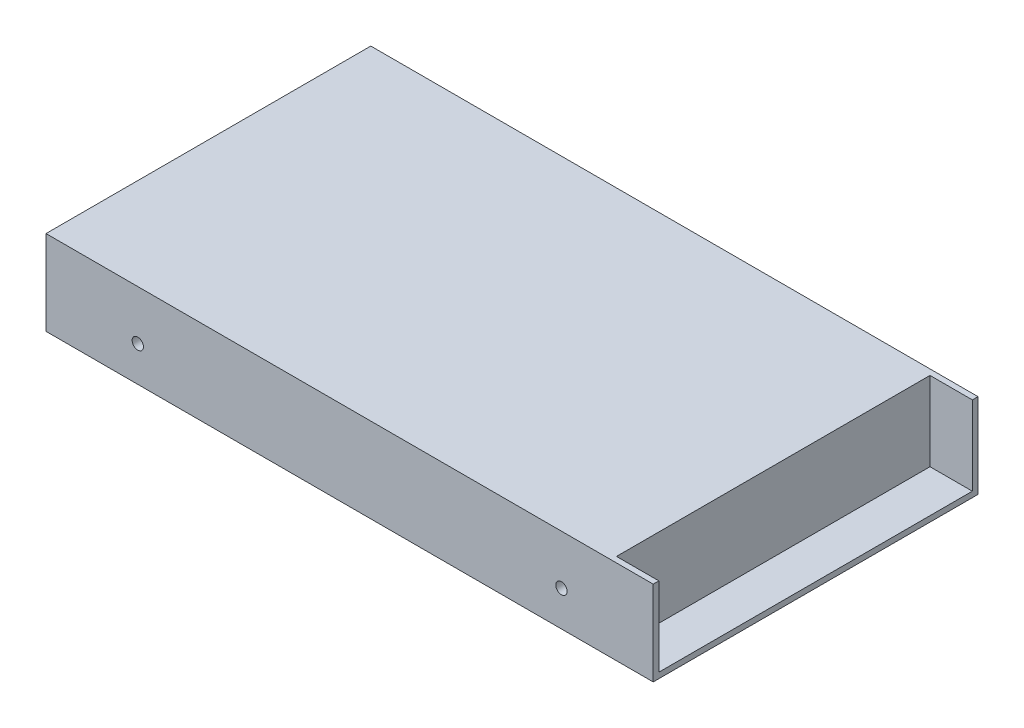
ISO-10303-21;
HEADER;
FILE_DESCRIPTION(('STEP AP214'),'2;1');
FILE_NAME('part.step','',(''),(''),'','','');
FILE_SCHEMA(('AUTOMOTIVE_DESIGN { 1 0 10303 214 1 1 1 1 }'));
ENDSEC;
DATA;
#1=APPLICATION_CONTEXT('core data for automotive mechanical design processes');
#2=APPLICATION_PROTOCOL_DEFINITION('international standard','automotive_design',2000,#1);
#3=PRODUCT_CONTEXT('',#1,'mechanical');
#4=PRODUCT('Part','Part','',(#3));
#5=PRODUCT_RELATED_PRODUCT_CATEGORY('part','',(#4));
#6=PRODUCT_DEFINITION_FORMATION('','',#4);
#7=PRODUCT_DEFINITION_CONTEXT('part definition',#1,'design');
#8=PRODUCT_DEFINITION('design','',#6,#7);
#9=PRODUCT_DEFINITION_SHAPE('','',#8);
#10=(LENGTH_UNIT() NAMED_UNIT(*) SI_UNIT(.MILLI.,.METRE.));
#11=(NAMED_UNIT(*) PLANE_ANGLE_UNIT() SI_UNIT($,.RADIAN.));
#12=(NAMED_UNIT(*) SI_UNIT($,.STERADIAN.) SOLID_ANGLE_UNIT());
#13=UNCERTAINTY_MEASURE_WITH_UNIT(LENGTH_MEASURE(1.E-05),#10,'distance_accuracy_value','');
#14=(GEOMETRIC_REPRESENTATION_CONTEXT(3) GLOBAL_UNCERTAINTY_ASSIGNED_CONTEXT((#13)) GLOBAL_UNIT_ASSIGNED_CONTEXT((#10,
#11,#12)) REPRESENTATION_CONTEXT('',''));
#15=CARTESIAN_POINT('',(0.,0.,0.));
#16=DIRECTION('',(0.,0.,1.));
#17=DIRECTION('',(1.,0.,0.));
#18=AXIS2_PLACEMENT_3D('',#15,#16,#17);
#19=CARTESIAN_POINT('',(107.5,30.,57.5));
#20=DIRECTION('',(-1.,0.,0.));
#21=DIRECTION('',(0.,0.,1.));
#22=AXIS2_PLACEMENT_3D('',#19,#20,#21);
#23=PLANE('',#22);
#24=DIRECTION('',(0.,0.,-1.));
#25=VECTOR('',#24,1.);
#26=CARTESIAN_POINT('',(107.5,30.,57.5));
#27=LINE('',#26,#25);
#28=CARTESIAN_POINT('',(107.5,30.,-55.5));
#29=VERTEX_POINT('',#28);
#30=CARTESIAN_POINT('',(107.5,30.,-57.5));
#31=VERTEX_POINT('',#30);
#32=EDGE_CURVE('E87',#29,#31,#27,.T.);
#33=ORIENTED_EDGE('',*,*,#32,.F.);
#34=DIRECTION('',(0.,1.,0.));
#35=VECTOR('',#34,1.);
#36=CARTESIAN_POINT('',(107.5,-112.008928215567,-55.5));
#37=LINE('',#36,#35);
#38=CARTESIAN_POINT('',(107.5,2.,-55.5));
#39=VERTEX_POINT('',#38);
#40=EDGE_CURVE('E136',#39,#29,#37,.T.);
#41=ORIENTED_EDGE('',*,*,#40,.F.);
#42=DIRECTION('',(0.,0.,-1.));
#43=VECTOR('',#42,1.);
#44=CARTESIAN_POINT('',(107.5,2.,-55.5));
#45=LINE('',#44,#43);
#46=CARTESIAN_POINT('',(107.5,2.,55.5));
#47=VERTEX_POINT('',#46);
#48=EDGE_CURVE('E127',#47,#39,#45,.T.);
#49=ORIENTED_EDGE('',*,*,#48,.F.);
#50=DIRECTION('',(0.,1.,0.));
#51=VECTOR('',#50,1.);
#52=CARTESIAN_POINT('',(107.5,-112.008928215567,55.5));
#53=LINE('',#52,#51);
#54=CARTESIAN_POINT('',(107.5,30.,55.5));
#55=VERTEX_POINT('',#54);
#56=EDGE_CURVE('E137',#47,#55,#53,.T.);
#57=ORIENTED_EDGE('',*,*,#56,.T.);
#58=CARTESIAN_POINT('',(107.5,30.,57.5));
#59=VERTEX_POINT('',#58);
#60=EDGE_CURVE('E145',#59,#55,#27,.T.);
#61=ORIENTED_EDGE('',*,*,#60,.F.);
#62=DIRECTION('',(0.,-1.,0.));
#63=VECTOR('',#62,1.);
#64=CARTESIAN_POINT('',(107.5,30.,57.5));
#65=LINE('',#64,#63);
#66=CARTESIAN_POINT('',(107.5,0.,57.5));
#67=VERTEX_POINT('',#66);
#68=EDGE_CURVE('E152',#59,#67,#65,.T.);
#69=ORIENTED_EDGE('',*,*,#68,.T.);
#70=DIRECTION('',(0.,0.,-1.));
#71=VECTOR('',#70,1.);
#72=CARTESIAN_POINT('',(107.5,0.,57.5));
#73=LINE('',#72,#71);
#74=CARTESIAN_POINT('',(107.5,0.,-57.5));
#75=VERTEX_POINT('',#74);
#76=EDGE_CURVE('E144',#67,#75,#73,.T.);
#77=ORIENTED_EDGE('',*,*,#76,.T.);
#78=DIRECTION('',(0.,-1.,0.));
#79=VECTOR('',#78,1.);
#80=CARTESIAN_POINT('',(107.5,30.,-57.5));
#81=LINE('',#80,#79);
#82=EDGE_CURVE('E12',#31,#75,#81,.T.);
#83=ORIENTED_EDGE('',*,*,#82,.F.);
#84=EDGE_LOOP('',(#33,#41,#49,#57,#61,#69,#77,#83));
#85=FACE_BOUND('',#84,.T.);
#86=ADVANCED_FACE('F36',(#85),#23,.F.);
#87=CARTESIAN_POINT('',(-107.5,30.,-57.5));
#88=DIRECTION('',(0.,0.,1.));
#89=DIRECTION('',(1.,0.,0.));
#90=AXIS2_PLACEMENT_3D('',#87,#88,#89);
#91=PLANE('',#90);
#92=CARTESIAN_POINT('',(75.,12.5,-57.5));
#93=DIRECTION('',(0.,0.,-1.));
#94=DIRECTION('',(-1.,0.,0.));
#95=AXIS2_PLACEMENT_3D('',#92,#93,#94);
#96=CIRCLE('',#95,2.);
#97=CARTESIAN_POINT('',(73.,12.5,-57.5));
#98=VERTEX_POINT('',#97);
#99=EDGE_CURVE('E205',#98,#98,#96,.T.);
#100=ORIENTED_EDGE('',*,*,#99,.F.);
#101=EDGE_LOOP('',(#100));
#102=FACE_BOUND('',#101,.T.);
#103=CARTESIAN_POINT('',(-75.,12.5,-57.5));
#104=DIRECTION('',(0.,0.,-1.));
#105=DIRECTION('',(-1.,0.,0.));
#106=AXIS2_PLACEMENT_3D('',#103,#104,#105);
#107=CIRCLE('',#106,2.);
#108=CARTESIAN_POINT('',(-77.,12.5,-57.5));
#109=VERTEX_POINT('',#108);
#110=EDGE_CURVE('E208',#109,#109,#107,.T.);
#111=ORIENTED_EDGE('',*,*,#110,.F.);
#112=EDGE_LOOP('',(#111));
#113=FACE_BOUND('',#112,.T.);
#114=DIRECTION('',(-1.,0.,0.));
#115=VECTOR('',#114,1.);
#116=CARTESIAN_POINT('',(-107.5,0.,-57.5));
#117=LINE('',#116,#115);
#118=CARTESIAN_POINT('',(-107.5,0.,-57.5));
#119=VERTEX_POINT('',#118);
#120=EDGE_CURVE('E155',#75,#119,#117,.T.);
#121=ORIENTED_EDGE('',*,*,#120,.T.);
#122=DIRECTION('',(0.,-1.,0.));
#123=VECTOR('',#122,1.);
#124=CARTESIAN_POINT('',(-107.5,30.,-57.5));
#125=LINE('',#124,#123);
#126=CARTESIAN_POINT('',(-107.5,30.,-57.5));
#127=VERTEX_POINT('',#126);
#128=EDGE_CURVE('E43',#127,#119,#125,.T.);
#129=ORIENTED_EDGE('',*,*,#128,.F.);
#130=DIRECTION('',(-1.,0.,0.));
#131=VECTOR('',#130,1.);
#132=CARTESIAN_POINT('',(-107.5,30.,-57.5));
#133=LINE('',#132,#131);
#134=EDGE_CURVE('E147',#31,#127,#133,.T.);
#135=ORIENTED_EDGE('',*,*,#134,.F.);
#136=ORIENTED_EDGE('',*,*,#82,.T.);
#137=EDGE_LOOP('',(#121,#129,#135,#136));
#138=FACE_BOUND('',#137,.T.);
#139=ADVANCED_FACE('F188',(#102,#113,#138),#91,.F.);
#140=CARTESIAN_POINT('',(-107.5,30.,57.5));
#141=DIRECTION('',(1.,0.,0.));
#142=DIRECTION('',(0.,0.,-1.));
#143=AXIS2_PLACEMENT_3D('',#140,#141,#142);
#144=PLANE('',#143);
#145=DIRECTION('',(0.,0.,1.));
#146=VECTOR('',#145,1.);
#147=CARTESIAN_POINT('',(-107.5,0.,57.5));
#148=LINE('',#147,#146);
#149=CARTESIAN_POINT('',(-107.5,0.,57.5));
#150=VERTEX_POINT('',#149);
#151=EDGE_CURVE('E157',#119,#150,#148,.T.);
#152=ORIENTED_EDGE('',*,*,#151,.T.);
#153=DIRECTION('',(0.,-1.,0.));
#154=VECTOR('',#153,1.);
#155=CARTESIAN_POINT('',(-107.5,30.,57.5));
#156=LINE('',#155,#154);
#157=CARTESIAN_POINT('',(-107.5,30.,57.5));
#158=VERTEX_POINT('',#157);
#159=EDGE_CURVE('E161',#158,#150,#156,.T.);
#160=ORIENTED_EDGE('',*,*,#159,.F.);
#161=DIRECTION('',(0.,0.,1.));
#162=VECTOR('',#161,1.);
#163=CARTESIAN_POINT('',(-107.5,30.,57.5));
#164=LINE('',#163,#162);
#165=EDGE_CURVE('E149',#127,#158,#164,.T.);
#166=ORIENTED_EDGE('',*,*,#165,.F.);
#167=ORIENTED_EDGE('',*,*,#128,.T.);
#168=EDGE_LOOP('',(#152,#160,#166,#167));
#169=FACE_BOUND('',#168,.T.);
#170=ADVANCED_FACE('F167',(#169),#144,.F.);
#171=CARTESIAN_POINT('',(-107.5,30.,57.5));
#172=DIRECTION('',(0.,0.,-1.));
#173=DIRECTION('',(-1.,0.,0.));
#174=AXIS2_PLACEMENT_3D('',#171,#172,#173);
#175=PLANE('',#174);
#176=CARTESIAN_POINT('',(75.,12.5,57.5));
#177=DIRECTION('',(0.,0.,1.));
#178=DIRECTION('',(1.,0.,0.));
#179=AXIS2_PLACEMENT_3D('',#176,#177,#178);
#180=CIRCLE('',#179,2.);
#181=CARTESIAN_POINT('',(77.,12.5,57.5));
#182=VERTEX_POINT('',#181);
#183=EDGE_CURVE('E219',#182,#182,#180,.T.);
#184=ORIENTED_EDGE('',*,*,#183,.F.);
#185=EDGE_LOOP('',(#184));
#186=FACE_BOUND('',#185,.T.);
#187=CARTESIAN_POINT('',(-75.,12.5,57.5));
#188=DIRECTION('',(0.,0.,1.));
#189=DIRECTION('',(1.,0.,0.));
#190=AXIS2_PLACEMENT_3D('',#187,#188,#189);
#191=CIRCLE('',#190,2.);
#192=CARTESIAN_POINT('',(-73.,12.5,57.5));
#193=VERTEX_POINT('',#192);
#194=EDGE_CURVE('E212',#193,#193,#191,.T.);
#195=ORIENTED_EDGE('',*,*,#194,.F.);
#196=EDGE_LOOP('',(#195));
#197=FACE_BOUND('',#196,.T.);
#198=DIRECTION('',(1.,0.,0.));
#199=VECTOR('',#198,1.);
#200=CARTESIAN_POINT('',(-107.5,0.,57.5));
#201=LINE('',#200,#199);
#202=EDGE_CURVE('E80',#150,#67,#201,.T.);
#203=ORIENTED_EDGE('',*,*,#202,.T.);
#204=ORIENTED_EDGE('',*,*,#68,.F.);
#205=DIRECTION('',(1.,0.,0.));
#206=VECTOR('',#205,1.);
#207=CARTESIAN_POINT('',(-107.5,30.,57.5));
#208=LINE('',#207,#206);
#209=EDGE_CURVE('E59',#158,#59,#208,.T.);
#210=ORIENTED_EDGE('',*,*,#209,.F.);
#211=ORIENTED_EDGE('',*,*,#159,.T.);
#212=EDGE_LOOP('',(#203,#204,#210,#211));
#213=FACE_BOUND('',#212,.T.);
#214=ADVANCED_FACE('F176',(#186,#197,#213),#175,.F.);
#215=CARTESIAN_POINT('',(0.,30.,0.));
#216=DIRECTION('',(0.,-1.,0.));
#217=DIRECTION('',(0.,0.,-1.));
#218=AXIS2_PLACEMENT_3D('',#215,#216,#217);
#219=PLANE('',#218);
#220=DIRECTION('',(0.,0.,1.));
#221=VECTOR('',#220,1.);
#222=CARTESIAN_POINT('',(92.5,30.,-55.5));
#223=LINE('',#222,#221);
#224=CARTESIAN_POINT('',(92.5,30.,-55.5));
#225=VERTEX_POINT('',#224);
#226=CARTESIAN_POINT('',(92.5,30.,55.5));
#227=VERTEX_POINT('',#226);
#228=EDGE_CURVE('E50',#225,#227,#223,.T.);
#229=ORIENTED_EDGE('',*,*,#228,.F.);
#230=DIRECTION('',(-1.,0.,0.));
#231=VECTOR('',#230,1.);
#232=CARTESIAN_POINT('',(107.5,30.,-55.5));
#233=LINE('',#232,#231);
#234=EDGE_CURVE('E123',#29,#225,#233,.T.);
#235=ORIENTED_EDGE('',*,*,#234,.F.);
#236=ORIENTED_EDGE('',*,*,#32,.T.);
#237=ORIENTED_EDGE('',*,*,#134,.T.);
#238=ORIENTED_EDGE('',*,*,#165,.T.);
#239=ORIENTED_EDGE('',*,*,#209,.T.);
#240=ORIENTED_EDGE('',*,*,#60,.T.);
#241=DIRECTION('',(1.,0.,0.));
#242=VECTOR('',#241,1.);
#243=CARTESIAN_POINT('',(107.5,30.,55.5));
#244=LINE('',#243,#242);
#245=EDGE_CURVE('E129',#227,#55,#244,.T.);
#246=ORIENTED_EDGE('',*,*,#245,.F.);
#247=EDGE_LOOP('',(#229,#235,#236,#237,#238,#239,#240,#246));
#248=FACE_BOUND('',#247,.T.);
#249=ADVANCED_FACE('F178',(#248),#219,.F.);
#250=CARTESIAN_POINT('',(0.,0.,0.));
#251=DIRECTION('',(0.,-1.,0.));
#252=DIRECTION('',(0.,0.,-1.));
#253=AXIS2_PLACEMENT_3D('',#250,#251,#252);
#254=PLANE('',#253);
#255=CARTESIAN_POINT('',(75.,0.,25.));
#256=DIRECTION('',(0.,-1.,0.));
#257=DIRECTION('',(0.,0.,-1.));
#258=AXIS2_PLACEMENT_3D('',#255,#256,#257);
#259=CIRCLE('',#258,2.);
#260=CARTESIAN_POINT('',(75.,0.,23.));
#261=VERTEX_POINT('',#260);
#262=EDGE_CURVE('E230',#261,#261,#259,.T.);
#263=ORIENTED_EDGE('',*,*,#262,.F.);
#264=EDGE_LOOP('',(#263));
#265=FACE_BOUND('',#264,.T.);
#266=CARTESIAN_POINT('',(-75.,0.,25.));
#267=DIRECTION('',(0.,-1.,0.));
#268=DIRECTION('',(0.,0.,-1.));
#269=AXIS2_PLACEMENT_3D('',#266,#267,#268);
#270=CIRCLE('',#269,2.);
#271=CARTESIAN_POINT('',(-75.,0.,23.));
#272=VERTEX_POINT('',#271);
#273=EDGE_CURVE('E237',#272,#272,#270,.T.);
#274=ORIENTED_EDGE('',*,*,#273,.F.);
#275=EDGE_LOOP('',(#274));
#276=FACE_BOUND('',#275,.T.);
#277=CARTESIAN_POINT('',(-75.,0.,-25.));
#278=DIRECTION('',(0.,-1.,0.));
#279=DIRECTION('',(0.,0.,-1.));
#280=AXIS2_PLACEMENT_3D('',#277,#278,#279);
#281=CIRCLE('',#280,2.);
#282=CARTESIAN_POINT('',(-75.,0.,-27.));
#283=VERTEX_POINT('',#282);
#284=EDGE_CURVE('E243',#283,#283,#281,.T.);
#285=ORIENTED_EDGE('',*,*,#284,.F.);
#286=EDGE_LOOP('',(#285));
#287=FACE_BOUND('',#286,.T.);
#288=CARTESIAN_POINT('',(75.,0.,-25.));
#289=DIRECTION('',(0.,-1.,0.));
#290=DIRECTION('',(0.,0.,-1.));
#291=AXIS2_PLACEMENT_3D('',#288,#289,#290);
#292=CIRCLE('',#291,2.);
#293=CARTESIAN_POINT('',(75.,0.,-27.));
#294=VERTEX_POINT('',#293);
#295=EDGE_CURVE('E224',#294,#294,#292,.T.);
#296=ORIENTED_EDGE('',*,*,#295,.F.);
#297=EDGE_LOOP('',(#296));
#298=FACE_BOUND('',#297,.T.);
#299=ORIENTED_EDGE('',*,*,#76,.F.);
#300=ORIENTED_EDGE('',*,*,#202,.F.);
#301=ORIENTED_EDGE('',*,*,#151,.F.);
#302=ORIENTED_EDGE('',*,*,#120,.F.);
#303=EDGE_LOOP('',(#299,#300,#301,#302));
#304=FACE_BOUND('',#303,.T.);
#305=ADVANCED_FACE('F172',(#265,#276,#287,#298,#304),#254,.T.);
#306=CARTESIAN_POINT('',(0.,2.,0.));
#307=DIRECTION('',(0.,-1.,0.));
#308=DIRECTION('',(0.,0.,-1.));
#309=AXIS2_PLACEMENT_3D('',#306,#307,#308);
#310=PLANE('',#309);
#311=ORIENTED_EDGE('',*,*,#48,.T.);
#312=DIRECTION('',(-1.,0.,0.));
#313=VECTOR('',#312,1.);
#314=CARTESIAN_POINT('',(107.5,2.,-55.5));
#315=LINE('',#314,#313);
#316=CARTESIAN_POINT('',(92.5,2.,-55.5));
#317=VERTEX_POINT('',#316);
#318=EDGE_CURVE('E121',#39,#317,#315,.T.);
#319=ORIENTED_EDGE('',*,*,#318,.T.);
#320=DIRECTION('',(0.,0.,1.));
#321=VECTOR('',#320,1.);
#322=CARTESIAN_POINT('',(92.5,2.,-55.5));
#323=LINE('',#322,#321);
#324=CARTESIAN_POINT('',(92.5,2.,55.5));
#325=VERTEX_POINT('',#324);
#326=EDGE_CURVE('E109',#317,#325,#323,.T.);
#327=ORIENTED_EDGE('',*,*,#326,.T.);
#328=DIRECTION('',(1.,0.,0.));
#329=VECTOR('',#328,1.);
#330=CARTESIAN_POINT('',(107.5,2.,55.5));
#331=LINE('',#330,#329);
#332=EDGE_CURVE('E138',#325,#47,#331,.T.);
#333=ORIENTED_EDGE('',*,*,#332,.T.);
#334=EDGE_LOOP('',(#311,#319,#327,#333));
#335=FACE_BOUND('',#334,.T.);
#336=ADVANCED_FACE('F125',(#335),#310,.F.);
#337=CARTESIAN_POINT('',(107.5,-112.008928215567,-55.5));
#338=DIRECTION('',(0.,0.,-1.));
#339=DIRECTION('',(-1.,0.,0.));
#340=AXIS2_PLACEMENT_3D('',#337,#338,#339);
#341=PLANE('',#340);
#342=ORIENTED_EDGE('',*,*,#40,.T.);
#343=ORIENTED_EDGE('',*,*,#234,.T.);
#344=DIRECTION('',(0.,1.,0.));
#345=VECTOR('',#344,1.);
#346=CARTESIAN_POINT('',(92.5,-112.008928215567,-55.5));
#347=LINE('',#346,#345);
#348=EDGE_CURVE('E112',#317,#225,#347,.T.);
#349=ORIENTED_EDGE('',*,*,#348,.F.);
#350=ORIENTED_EDGE('',*,*,#318,.F.);
#351=EDGE_LOOP('',(#342,#343,#349,#350));
#352=FACE_BOUND('',#351,.T.);
#353=ADVANCED_FACE('F120',(#352),#341,.F.);
#354=CARTESIAN_POINT('',(92.5,-112.008928215567,-55.5));
#355=DIRECTION('',(-1.,0.,0.));
#356=DIRECTION('',(0.,0.,1.));
#357=AXIS2_PLACEMENT_3D('',#354,#355,#356);
#358=PLANE('',#357);
#359=ORIENTED_EDGE('',*,*,#348,.T.);
#360=ORIENTED_EDGE('',*,*,#228,.T.);
#361=DIRECTION('',(0.,1.,0.));
#362=VECTOR('',#361,1.);
#363=CARTESIAN_POINT('',(92.5,-112.008928215567,55.5));
#364=LINE('',#363,#362);
#365=EDGE_CURVE('E114',#325,#227,#364,.T.);
#366=ORIENTED_EDGE('',*,*,#365,.F.);
#367=ORIENTED_EDGE('',*,*,#326,.F.);
#368=EDGE_LOOP('',(#359,#360,#366,#367));
#369=FACE_BOUND('',#368,.T.);
#370=ADVANCED_FACE('F111',(#369),#358,.F.);
#371=CARTESIAN_POINT('',(107.5,-112.008928215567,55.5));
#372=DIRECTION('',(0.,0.,1.));
#373=DIRECTION('',(1.,0.,0.));
#374=AXIS2_PLACEMENT_3D('',#371,#372,#373);
#375=PLANE('',#374);
#376=ORIENTED_EDGE('',*,*,#365,.T.);
#377=ORIENTED_EDGE('',*,*,#245,.T.);
#378=ORIENTED_EDGE('',*,*,#56,.F.);
#379=ORIENTED_EDGE('',*,*,#332,.F.);
#380=EDGE_LOOP('',(#376,#377,#378,#379));
#381=FACE_BOUND('',#380,.T.);
#382=ADVANCED_FACE('F322',(#381),#375,.F.);
#383=CARTESIAN_POINT('',(-75.,12.5,52.5));
#384=DIRECTION('',(0.,0.,1.));
#385=DIRECTION('',(1.,0.,0.));
#386=AXIS2_PLACEMENT_3D('',#383,#384,#385);
#387=CYLINDRICAL_SURFACE('',#386,2.);
#388=CARTESIAN_POINT('',(-75.,12.5,52.5));
#389=DIRECTION('',(0.,0.,1.));
#390=DIRECTION('',(1.,0.,0.));
#391=AXIS2_PLACEMENT_3D('',#388,#389,#390);
#392=CIRCLE('',#391,2.);
#393=CARTESIAN_POINT('',(-73.,12.5,52.5));
#394=VERTEX_POINT('',#393);
#395=EDGE_CURVE('E215',#394,#394,#392,.T.);
#396=ORIENTED_EDGE('',*,*,#395,.F.);
#397=EDGE_LOOP('',(#396));
#398=FACE_BOUND('',#397,.T.);
#399=ORIENTED_EDGE('',*,*,#194,.T.);
#400=EDGE_LOOP('',(#399));
#401=FACE_BOUND('',#400,.T.);
#402=ADVANCED_FACE('F318',(#398,#401),#387,.F.);
#403=CARTESIAN_POINT('',(-75.,12.5,52.5));
#404=DIRECTION('',(0.,0.,1.));
#405=DIRECTION('',(1.,0.,0.));
#406=AXIS2_PLACEMENT_3D('',#403,#404,#405);
#407=PLANE('',#406);
#408=ORIENTED_EDGE('',*,*,#395,.T.);
#409=EDGE_LOOP('',(#408));
#410=FACE_BOUND('',#409,.T.);
#411=ADVANCED_FACE('F314',(#410),#407,.T.);
#412=CARTESIAN_POINT('',(75.,12.5,52.5));
#413=DIRECTION('',(0.,0.,1.));
#414=DIRECTION('',(1.,0.,0.));
#415=AXIS2_PLACEMENT_3D('',#412,#413,#414);
#416=CYLINDRICAL_SURFACE('',#415,2.);
#417=CARTESIAN_POINT('',(75.,12.5,52.5));
#418=DIRECTION('',(0.,0.,1.));
#419=DIRECTION('',(1.,0.,0.));
#420=AXIS2_PLACEMENT_3D('',#417,#418,#419);
#421=CIRCLE('',#420,2.);
#422=CARTESIAN_POINT('',(77.,12.5,52.5));
#423=VERTEX_POINT('',#422);
#424=EDGE_CURVE('E210',#423,#423,#421,.T.);
#425=ORIENTED_EDGE('',*,*,#424,.F.);
#426=EDGE_LOOP('',(#425));
#427=FACE_BOUND('',#426,.T.);
#428=ORIENTED_EDGE('',*,*,#183,.T.);
#429=EDGE_LOOP('',(#428));
#430=FACE_BOUND('',#429,.T.);
#431=ADVANCED_FACE('F310',(#427,#430),#416,.F.);
#432=CARTESIAN_POINT('',(75.,12.5,52.5));
#433=DIRECTION('',(0.,0.,1.));
#434=DIRECTION('',(1.,0.,0.));
#435=AXIS2_PLACEMENT_3D('',#432,#433,#434);
#436=PLANE('',#435);
#437=ORIENTED_EDGE('',*,*,#424,.T.);
#438=EDGE_LOOP('',(#437));
#439=FACE_BOUND('',#438,.T.);
#440=ADVANCED_FACE('F306',(#439),#436,.T.);
#441=CARTESIAN_POINT('',(75.,3.,-25.));
#442=DIRECTION('',(0.,-1.,0.));
#443=DIRECTION('',(0.,0.,-1.));
#444=AXIS2_PLACEMENT_3D('',#441,#442,#443);
#445=CYLINDRICAL_SURFACE('',#444,2.);
#446=CARTESIAN_POINT('',(75.,3.,-25.));
#447=DIRECTION('',(0.,-1.,0.));
#448=DIRECTION('',(0.,0.,-1.));
#449=AXIS2_PLACEMENT_3D('',#446,#447,#448);
#450=CIRCLE('',#449,2.);
#451=CARTESIAN_POINT('',(75.,3.,-27.));
#452=VERTEX_POINT('',#451);
#453=EDGE_CURVE('E216',#452,#452,#450,.T.);
#454=ORIENTED_EDGE('',*,*,#453,.F.);
#455=EDGE_LOOP('',(#454));
#456=FACE_BOUND('',#455,.T.);
#457=ORIENTED_EDGE('',*,*,#295,.T.);
#458=EDGE_LOOP('',(#457));
#459=FACE_BOUND('',#458,.T.);
#460=ADVANCED_FACE('F302',(#456,#459),#445,.F.);
#461=CARTESIAN_POINT('',(75.,3.,-25.));
#462=DIRECTION('',(0.,-1.,0.));
#463=DIRECTION('',(0.,0.,-1.));
#464=AXIS2_PLACEMENT_3D('',#461,#462,#463);
#465=PLANE('',#464);
#466=ORIENTED_EDGE('',*,*,#453,.T.);
#467=EDGE_LOOP('',(#466));
#468=FACE_BOUND('',#467,.T.);
#469=ADVANCED_FACE('F284',(#468),#465,.T.);
#470=CARTESIAN_POINT('',(-75.,3.,-25.));
#471=DIRECTION('',(0.,-1.,0.));
#472=DIRECTION('',(0.,0.,-1.));
#473=AXIS2_PLACEMENT_3D('',#470,#471,#472);
#474=CYLINDRICAL_SURFACE('',#473,2.);
#475=CARTESIAN_POINT('',(-75.,3.,-25.));
#476=DIRECTION('',(0.,-1.,0.));
#477=DIRECTION('',(0.,0.,-1.));
#478=AXIS2_PLACEMENT_3D('',#475,#476,#477);
#479=CIRCLE('',#478,2.);
#480=CARTESIAN_POINT('',(-75.,3.,-27.));
#481=VERTEX_POINT('',#480);
#482=EDGE_CURVE('E227',#481,#481,#479,.T.);
#483=ORIENTED_EDGE('',*,*,#482,.F.);
#484=EDGE_LOOP('',(#483));
#485=FACE_BOUND('',#484,.T.);
#486=ORIENTED_EDGE('',*,*,#284,.T.);
#487=EDGE_LOOP('',(#486));
#488=FACE_BOUND('',#487,.T.);
#489=ADVANCED_FACE('F280',(#485,#488),#474,.F.);
#490=CARTESIAN_POINT('',(-75.,3.,-25.));
#491=DIRECTION('',(0.,-1.,0.));
#492=DIRECTION('',(0.,0.,-1.));
#493=AXIS2_PLACEMENT_3D('',#490,#491,#492);
#494=PLANE('',#493);
#495=ORIENTED_EDGE('',*,*,#482,.T.);
#496=EDGE_LOOP('',(#495));
#497=FACE_BOUND('',#496,.T.);
#498=ADVANCED_FACE('F276',(#497),#494,.T.);
#499=CARTESIAN_POINT('',(-75.,3.,25.));
#500=DIRECTION('',(0.,-1.,0.));
#501=DIRECTION('',(0.,0.,-1.));
#502=AXIS2_PLACEMENT_3D('',#499,#500,#501);
#503=CYLINDRICAL_SURFACE('',#502,2.);
#504=CARTESIAN_POINT('',(-75.,3.,25.));
#505=DIRECTION('',(0.,-1.,0.));
#506=DIRECTION('',(0.,0.,-1.));
#507=AXIS2_PLACEMENT_3D('',#504,#505,#506);
#508=CIRCLE('',#507,2.);
#509=CARTESIAN_POINT('',(-75.,3.,23.));
#510=VERTEX_POINT('',#509);
#511=EDGE_CURVE('E240',#510,#510,#508,.T.);
#512=ORIENTED_EDGE('',*,*,#511,.F.);
#513=EDGE_LOOP('',(#512));
#514=FACE_BOUND('',#513,.T.);
#515=ORIENTED_EDGE('',*,*,#273,.T.);
#516=EDGE_LOOP('',(#515));
#517=FACE_BOUND('',#516,.T.);
#518=ADVANCED_FACE('F279',(#514,#517),#503,.F.);
#519=CARTESIAN_POINT('',(-75.,3.,25.));
#520=DIRECTION('',(0.,-1.,0.));
#521=DIRECTION('',(0.,0.,-1.));
#522=AXIS2_PLACEMENT_3D('',#519,#520,#521);
#523=PLANE('',#522);
#524=ORIENTED_EDGE('',*,*,#511,.T.);
#525=EDGE_LOOP('',(#524));
#526=FACE_BOUND('',#525,.T.);
#527=ADVANCED_FACE('F286',(#526),#523,.T.);
#528=CARTESIAN_POINT('',(75.,3.,25.));
#529=DIRECTION('',(0.,-1.,0.));
#530=DIRECTION('',(0.,0.,-1.));
#531=AXIS2_PLACEMENT_3D('',#528,#529,#530);
#532=CYLINDRICAL_SURFACE('',#531,2.);
#533=CARTESIAN_POINT('',(75.,3.,25.));
#534=DIRECTION('',(0.,-1.,0.));
#535=DIRECTION('',(0.,0.,-1.));
#536=AXIS2_PLACEMENT_3D('',#533,#534,#535);
#537=CIRCLE('',#536,2.);
#538=CARTESIAN_POINT('',(75.,3.,23.));
#539=VERTEX_POINT('',#538);
#540=EDGE_CURVE('E233',#539,#539,#537,.T.);
#541=ORIENTED_EDGE('',*,*,#540,.F.);
#542=EDGE_LOOP('',(#541));
#543=FACE_BOUND('',#542,.T.);
#544=ORIENTED_EDGE('',*,*,#262,.T.);
#545=EDGE_LOOP('',(#544));
#546=FACE_BOUND('',#545,.T.);
#547=ADVANCED_FACE('F289',(#543,#546),#532,.F.);
#548=CARTESIAN_POINT('',(75.,3.,25.));
#549=DIRECTION('',(0.,-1.,0.));
#550=DIRECTION('',(0.,0.,-1.));
#551=AXIS2_PLACEMENT_3D('',#548,#549,#550);
#552=PLANE('',#551);
#553=ORIENTED_EDGE('',*,*,#540,.T.);
#554=EDGE_LOOP('',(#553));
#555=FACE_BOUND('',#554,.T.);
#556=ADVANCED_FACE('F274',(#555),#552,.T.);
#557=CARTESIAN_POINT('',(-75.,12.5,-52.5));
#558=DIRECTION('',(0.,0.,-1.));
#559=DIRECTION('',(-1.,0.,0.));
#560=AXIS2_PLACEMENT_3D('',#557,#558,#559);
#561=CYLINDRICAL_SURFACE('',#560,2.);
#562=CARTESIAN_POINT('',(-75.,12.5,-52.5));
#563=DIRECTION('',(0.,0.,-1.));
#564=DIRECTION('',(-1.,0.,0.));
#565=AXIS2_PLACEMENT_3D('',#562,#563,#564);
#566=CIRCLE('',#565,2.);
#567=CARTESIAN_POINT('',(-77.,12.5,-52.5));
#568=VERTEX_POINT('',#567);
#569=EDGE_CURVE('E249',#568,#568,#566,.T.);
#570=ORIENTED_EDGE('',*,*,#569,.F.);
#571=EDGE_LOOP('',(#570));
#572=FACE_BOUND('',#571,.T.);
#573=ORIENTED_EDGE('',*,*,#110,.T.);
#574=EDGE_LOOP('',(#573));
#575=FACE_BOUND('',#574,.T.);
#576=ADVANCED_FACE('F268',(#572,#575),#561,.F.);
#577=CARTESIAN_POINT('',(-75.,12.5,-52.5));
#578=DIRECTION('',(0.,0.,-1.));
#579=DIRECTION('',(-1.,0.,0.));
#580=AXIS2_PLACEMENT_3D('',#577,#578,#579);
#581=PLANE('',#580);
#582=ORIENTED_EDGE('',*,*,#569,.T.);
#583=EDGE_LOOP('',(#582));
#584=FACE_BOUND('',#583,.T.);
#585=ADVANCED_FACE('F261',(#584),#581,.T.);
#586=CARTESIAN_POINT('',(75.,12.5,-52.5));
#587=DIRECTION('',(0.,0.,-1.));
#588=DIRECTION('',(-1.,0.,0.));
#589=AXIS2_PLACEMENT_3D('',#586,#587,#588);
#590=CYLINDRICAL_SURFACE('',#589,2.);
#591=CARTESIAN_POINT('',(75.,12.5,-52.5));
#592=DIRECTION('',(0.,0.,-1.));
#593=DIRECTION('',(-1.,0.,0.));
#594=AXIS2_PLACEMENT_3D('',#591,#592,#593);
#595=CIRCLE('',#594,2.);
#596=CARTESIAN_POINT('',(73.,12.5,-52.5));
#597=VERTEX_POINT('',#596);
#598=EDGE_CURVE('E234',#597,#597,#595,.T.);
#599=ORIENTED_EDGE('',*,*,#598,.F.);
#600=EDGE_LOOP('',(#599));
#601=FACE_BOUND('',#600,.T.);
#602=ORIENTED_EDGE('',*,*,#99,.T.);
#603=EDGE_LOOP('',(#602));
#604=FACE_BOUND('',#603,.T.);
#605=ADVANCED_FACE('F258',(#601,#604),#590,.F.);
#606=CARTESIAN_POINT('',(75.,12.5,-52.5));
#607=DIRECTION('',(0.,0.,-1.));
#608=DIRECTION('',(-1.,0.,0.));
#609=AXIS2_PLACEMENT_3D('',#606,#607,#608);
#610=PLANE('',#609);
#611=ORIENTED_EDGE('',*,*,#598,.T.);
#612=EDGE_LOOP('',(#611));
#613=FACE_BOUND('',#612,.T.);
#614=ADVANCED_FACE('F256',(#613),#610,.T.);
#615=CLOSED_SHELL('',(#86,#139,#170,#214,#249,#305,#336,#353,#370,#382,#402,#411,#431,#440,#460,
#469,#489,#498,#518,#527,#547,#556,#576,#585,#605,#614));
#616=MANIFOLD_SOLID_BREP('B2',#615);
#617=ADVANCED_BREP_SHAPE_REPRESENTATION('',(#18,#616),#14);
#618=SHAPE_DEFINITION_REPRESENTATION(#9,#617);
ENDSEC;
END-ISO-10303-21;
